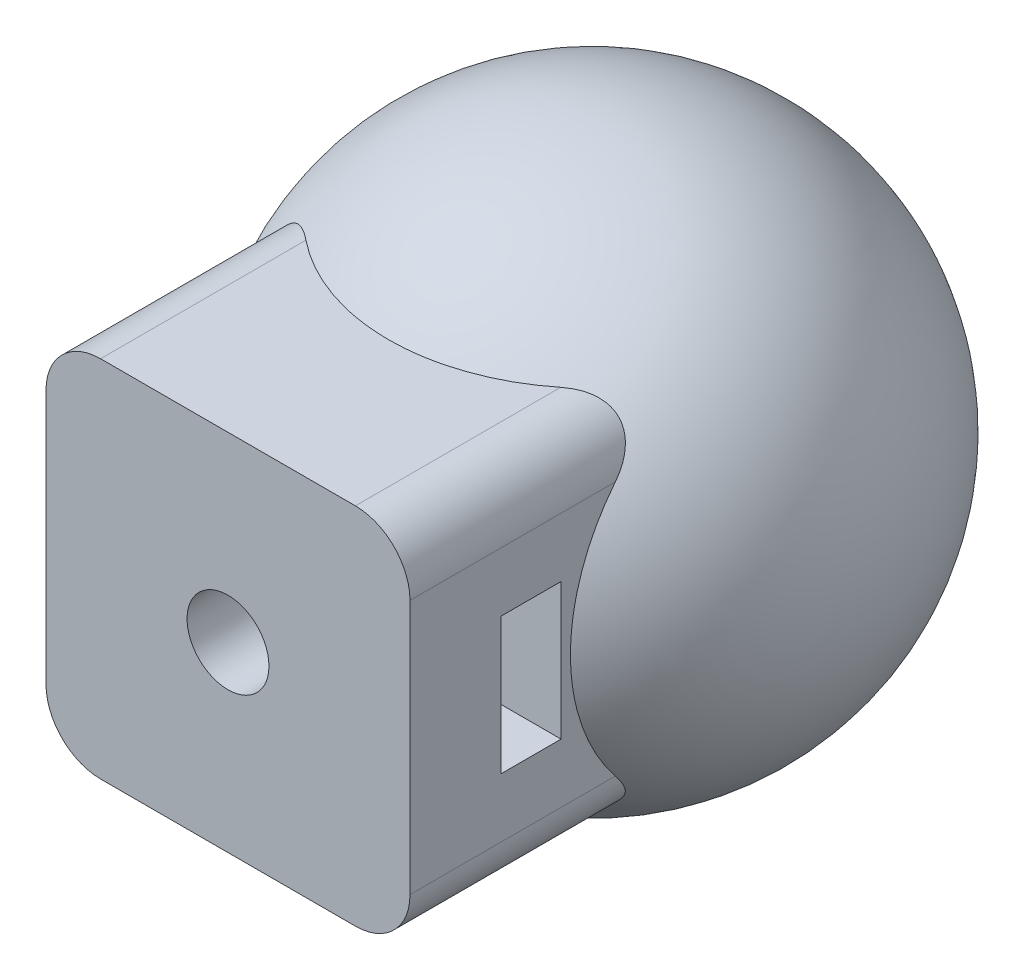
ISO-10303-21;
HEADER;
FILE_DESCRIPTION(('STEP AP214'),'2;1');
FILE_NAME('part.step','',(''),(''),'','','');
FILE_SCHEMA(('AUTOMOTIVE_DESIGN { 1 0 10303 214 1 1 1 1 }'));
ENDSEC;
DATA;
#1=APPLICATION_CONTEXT('core data for automotive mechanical design processes');
#2=APPLICATION_PROTOCOL_DEFINITION('international standard','automotive_design',2000,#1);
#3=PRODUCT_CONTEXT('',#1,'mechanical');
#4=PRODUCT('Part','Part','',(#3));
#5=PRODUCT_RELATED_PRODUCT_CATEGORY('part','',(#4));
#6=PRODUCT_DEFINITION_FORMATION('','',#4);
#7=PRODUCT_DEFINITION_CONTEXT('part definition',#1,'design');
#8=PRODUCT_DEFINITION('design','',#6,#7);
#9=PRODUCT_DEFINITION_SHAPE('','',#8);
#10=(LENGTH_UNIT() NAMED_UNIT(*) SI_UNIT(.MILLI.,.METRE.));
#11=(NAMED_UNIT(*) PLANE_ANGLE_UNIT() SI_UNIT($,.RADIAN.));
#12=(NAMED_UNIT(*) SI_UNIT($,.STERADIAN.) SOLID_ANGLE_UNIT());
#13=UNCERTAINTY_MEASURE_WITH_UNIT(LENGTH_MEASURE(1.E-05),#10,'distance_accuracy_value','');
#14=(GEOMETRIC_REPRESENTATION_CONTEXT(3) GLOBAL_UNCERTAINTY_ASSIGNED_CONTEXT((#13)) GLOBAL_UNIT_ASSIGNED_CONTEXT((#10,
#11,#12)) REPRESENTATION_CONTEXT('',''));
#15=CARTESIAN_POINT('',(0.,0.,0.));
#16=DIRECTION('',(0.,0.,1.));
#17=DIRECTION('',(1.,0.,0.));
#18=AXIS2_PLACEMENT_3D('',#15,#16,#17);
#19=CARTESIAN_POINT('',(9.99999999999999,10.,20.));
#20=DIRECTION('',(-1.,0.,0.));
#21=DIRECTION('',(0.,-1.,0.));
#22=AXIS2_PLACEMENT_3D('',#19,#20,#21);
#23=PLANE('',#22);
#24=DIRECTION('',(0.,1.,0.));
#25=VECTOR('',#24,1.);
#26=CARTESIAN_POINT('',(9.99999999999999,10.,20.));
#27=LINE('',#26,#25);
#28=CARTESIAN_POINT('',(10.,-7.,20.));
#29=VERTEX_POINT('',#28);
#30=CARTESIAN_POINT('',(9.99999999999999,7.,20.));
#31=VERTEX_POINT('',#30);
#32=EDGE_CURVE('E209',#29,#31,#27,.T.);
#33=ORIENTED_EDGE('',*,*,#32,.F.);
#34=DIRECTION('',(0.,0.,-1.));
#35=VECTOR('',#34,1.);
#36=CARTESIAN_POINT('',(10.,-7.,20.));
#37=LINE('',#36,#35);
#38=CARTESIAN_POINT('',(10.,-7.,8.71779788708134));
#39=VERTEX_POINT('',#38);
#40=EDGE_CURVE('E279',#29,#39,#37,.T.);
#41=ORIENTED_EDGE('',*,*,#40,.T.);
#42=CARTESIAN_POINT('',(10.,0.,0.));
#43=DIRECTION('',(-1.,0.,0.));
#44=DIRECTION('',(0.,-1.,0.));
#45=AXIS2_PLACEMENT_3D('',#42,#43,#44);
#46=CIRCLE('',#45,11.180339887499);
#47=CARTESIAN_POINT('',(9.99999999999999,7.,8.71779788708135));
#48=VERTEX_POINT('',#47);
#49=EDGE_CURVE('E240',#48,#39,#46,.F.);
#50=ORIENTED_EDGE('',*,*,#49,.F.);
#51=DIRECTION('',(0.,0.,-1.));
#52=VECTOR('',#51,1.);
#53=CARTESIAN_POINT('',(9.99999999999999,7.,20.));
#54=LINE('',#53,#52);
#55=EDGE_CURVE('E276',#48,#31,#54,.F.);
#56=ORIENTED_EDGE('',*,*,#55,.T.);
#57=EDGE_LOOP('',(#33,#41,#50,#56));
#58=FACE_BOUND('',#57,.T.);
#59=DIRECTION('',(0.,1.,0.));
#60=VECTOR('',#59,1.);
#61=CARTESIAN_POINT('',(10.,-3.75,11.7));
#62=LINE('',#61,#60);
#63=CARTESIAN_POINT('',(10.,-3.75,11.7));
#64=VERTEX_POINT('',#63);
#65=CARTESIAN_POINT('',(10.,3.75,11.7));
#66=VERTEX_POINT('',#65);
#67=EDGE_CURVE('E159',#64,#66,#62,.T.);
#68=ORIENTED_EDGE('',*,*,#67,.F.);
#69=DIRECTION('',(0.,0.,1.));
#70=VECTOR('',#69,1.);
#71=CARTESIAN_POINT('',(10.,-3.75,11.7));
#72=LINE('',#71,#70);
#73=CARTESIAN_POINT('',(10.,-3.75,15.));
#74=VERTEX_POINT('',#73);
#75=EDGE_CURVE('E139',#64,#74,#72,.T.);
#76=ORIENTED_EDGE('',*,*,#75,.T.);
#77=DIRECTION('',(0.,1.,0.));
#78=VECTOR('',#77,1.);
#79=CARTESIAN_POINT('',(10.,-3.75,15.));
#80=LINE('',#79,#78);
#81=CARTESIAN_POINT('',(10.,3.75,15.));
#82=VERTEX_POINT('',#81);
#83=EDGE_CURVE('E176',#74,#82,#80,.T.);
#84=ORIENTED_EDGE('',*,*,#83,.T.);
#85=DIRECTION('',(0.,0.,1.));
#86=VECTOR('',#85,1.);
#87=CARTESIAN_POINT('',(10.,3.75,11.7));
#88=LINE('',#87,#86);
#89=EDGE_CURVE('E151',#66,#82,#88,.T.);
#90=ORIENTED_EDGE('',*,*,#89,.F.);
#91=EDGE_LOOP('',(#68,#76,#84,#90));
#92=FACE_BOUND('',#91,.T.);
#93=ADVANCED_FACE('F39',(#58,#92),#23,.F.);
#94=CARTESIAN_POINT('',(-10.,10.,20.));
#95=DIRECTION('',(0.,-1.,0.));
#96=DIRECTION('',(0.,0.,-1.));
#97=AXIS2_PLACEMENT_3D('',#94,#95,#96);
#98=PLANE('',#97);
#99=DIRECTION('',(-1.,0.,0.));
#100=VECTOR('',#99,1.);
#101=CARTESIAN_POINT('',(-10.,10.,20.));
#102=LINE('',#101,#100);
#103=CARTESIAN_POINT('',(7.,10.,20.));
#104=VERTEX_POINT('',#103);
#105=CARTESIAN_POINT('',(-7.,10.,20.));
#106=VERTEX_POINT('',#105);
#107=EDGE_CURVE('E218',#104,#106,#102,.T.);
#108=ORIENTED_EDGE('',*,*,#107,.F.);
#109=DIRECTION('',(0.,0.,-1.));
#110=VECTOR('',#109,1.);
#111=CARTESIAN_POINT('',(7.,10.,20.));
#112=LINE('',#111,#110);
#113=CARTESIAN_POINT('',(7.,10.,8.71779788708135));
#114=VERTEX_POINT('',#113);
#115=EDGE_CURVE('E286',#104,#114,#112,.T.);
#116=ORIENTED_EDGE('',*,*,#115,.T.);
#117=CARTESIAN_POINT('',(0.,10.,0.));
#118=DIRECTION('',(0.,-1.,0.));
#119=DIRECTION('',(0.,0.,-1.));
#120=AXIS2_PLACEMENT_3D('',#117,#118,#119);
#121=CIRCLE('',#120,11.180339887499);
#122=CARTESIAN_POINT('',(-7.,10.,8.71779788708134));
#123=VERTEX_POINT('',#122);
#124=EDGE_CURVE('E237',#123,#114,#121,.F.);
#125=ORIENTED_EDGE('',*,*,#124,.F.);
#126=DIRECTION('',(0.,0.,-1.));
#127=VECTOR('',#126,1.);
#128=CARTESIAN_POINT('',(-7.,10.,20.));
#129=LINE('',#128,#127);
#130=EDGE_CURVE('E283',#123,#106,#129,.F.);
#131=ORIENTED_EDGE('',*,*,#130,.T.);
#132=EDGE_LOOP('',(#108,#116,#125,#131));
#133=FACE_BOUND('',#132,.T.);
#134=ADVANCED_FACE('F334',(#133),#98,.F.);
#135=CARTESIAN_POINT('',(-10.,10.,20.));
#136=DIRECTION('',(1.,0.,0.));
#137=DIRECTION('',(0.,1.,0.));
#138=AXIS2_PLACEMENT_3D('',#135,#136,#137);
#139=PLANE('',#138);
#140=CARTESIAN_POINT('',(-10.,0.,0.));
#141=DIRECTION('',(1.,0.,0.));
#142=DIRECTION('',(0.,1.,0.));
#143=AXIS2_PLACEMENT_3D('',#140,#141,#142);
#144=CIRCLE('',#143,11.1803398874989);
#145=CARTESIAN_POINT('',(-10.,-7.,8.71779788708134));
#146=VERTEX_POINT('',#145);
#147=CARTESIAN_POINT('',(-10.,7.,8.71779788708134));
#148=VERTEX_POINT('',#147);
#149=EDGE_CURVE('E234',#146,#148,#144,.F.);
#150=ORIENTED_EDGE('',*,*,#149,.F.);
#151=DIRECTION('',(0.,0.,-1.));
#152=VECTOR('',#151,1.);
#153=CARTESIAN_POINT('',(-10.,-7.,20.));
#154=LINE('',#153,#152);
#155=CARTESIAN_POINT('',(-10.,-7.,20.));
#156=VERTEX_POINT('',#155);
#157=EDGE_CURVE('E261',#146,#156,#154,.F.);
#158=ORIENTED_EDGE('',*,*,#157,.T.);
#159=DIRECTION('',(0.,-1.,0.));
#160=VECTOR('',#159,1.);
#161=CARTESIAN_POINT('',(-10.,10.,20.));
#162=LINE('',#161,#160);
#163=CARTESIAN_POINT('',(-10.,7.,20.));
#164=VERTEX_POINT('',#163);
#165=EDGE_CURVE('E222',#164,#156,#162,.T.);
#166=ORIENTED_EDGE('',*,*,#165,.F.);
#167=DIRECTION('',(0.,0.,-1.));
#168=VECTOR('',#167,1.);
#169=CARTESIAN_POINT('',(-10.,7.,20.));
#170=LINE('',#169,#168);
#171=EDGE_CURVE('E257',#164,#148,#170,.T.);
#172=ORIENTED_EDGE('',*,*,#171,.T.);
#173=EDGE_LOOP('',(#150,#158,#166,#172));
#174=FACE_BOUND('',#173,.T.);
#175=ADVANCED_FACE('F339',(#174),#139,.F.);
#176=CARTESIAN_POINT('',(-10.,-10.,20.));
#177=DIRECTION('',(0.,1.,0.));
#178=DIRECTION('',(0.,0.,1.));
#179=AXIS2_PLACEMENT_3D('',#176,#177,#178);
#180=PLANE('',#179);
#181=DIRECTION('',(1.,0.,0.));
#182=VECTOR('',#181,1.);
#183=CARTESIAN_POINT('',(-10.,-10.,20.));
#184=LINE('',#183,#182);
#185=CARTESIAN_POINT('',(-7.,-10.,20.));
#186=VERTEX_POINT('',#185);
#187=CARTESIAN_POINT('',(7.,-10.,20.));
#188=VERTEX_POINT('',#187);
#189=EDGE_CURVE('E226',#186,#188,#184,.T.);
#190=ORIENTED_EDGE('',*,*,#189,.F.);
#191=DIRECTION('',(0.,0.,-1.));
#192=VECTOR('',#191,1.);
#193=CARTESIAN_POINT('',(-7.,-10.,20.));
#194=LINE('',#193,#192);
#195=CARTESIAN_POINT('',(-7.,-10.,8.71779788708134));
#196=VERTEX_POINT('',#195);
#197=EDGE_CURVE('E253',#186,#196,#194,.T.);
#198=ORIENTED_EDGE('',*,*,#197,.T.);
#199=CARTESIAN_POINT('',(0.,-10.,0.));
#200=DIRECTION('',(0.,1.,0.));
#201=DIRECTION('',(0.,0.,1.));
#202=AXIS2_PLACEMENT_3D('',#199,#200,#201);
#203=CIRCLE('',#202,11.1803398874989);
#204=CARTESIAN_POINT('',(7.,-10.,8.71779788708134));
#205=VERTEX_POINT('',#204);
#206=EDGE_CURVE('E230',#205,#196,#203,.F.);
#207=ORIENTED_EDGE('',*,*,#206,.F.);
#208=DIRECTION('',(0.,0.,-1.));
#209=VECTOR('',#208,1.);
#210=CARTESIAN_POINT('',(7.,-10.,20.));
#211=LINE('',#210,#209);
#212=EDGE_CURVE('E244',#205,#188,#211,.F.);
#213=ORIENTED_EDGE('',*,*,#212,.T.);
#214=EDGE_LOOP('',(#190,#198,#207,#213));
#215=FACE_BOUND('',#214,.T.);
#216=ADVANCED_FACE('F351',(#215),#180,.F.);
#217=CARTESIAN_POINT('',(0.,0.,20.));
#218=DIRECTION('',(0.,0.,1.));
#219=DIRECTION('',(1.,0.,0.));
#220=AXIS2_PLACEMENT_3D('',#217,#218,#219);
#221=PLANE('',#220);
#222=CARTESIAN_POINT('',(0.,0.,20.));
#223=DIRECTION('',(0.,0.,1.));
#224=DIRECTION('',(1.,0.,0.));
#225=AXIS2_PLACEMENT_3D('',#222,#223,#224);
#226=CIRCLE('',#225,2.25);
#227=CARTESIAN_POINT('',(2.25,0.,20.));
#228=VERTEX_POINT('',#227);
#229=EDGE_CURVE('E210',#228,#228,#226,.T.);
#230=ORIENTED_EDGE('',*,*,#229,.F.);
#231=EDGE_LOOP('',(#230));
#232=FACE_BOUND('',#231,.T.);
#233=ORIENTED_EDGE('',*,*,#165,.T.);
#234=CARTESIAN_POINT('',(-7.,-7.,20.));
#235=DIRECTION('',(0.,0.,1.));
#236=DIRECTION('',(1.,0.,0.));
#237=AXIS2_PLACEMENT_3D('',#234,#235,#236);
#238=CIRCLE('',#237,3.);
#239=EDGE_CURVE('E273',#156,#186,#238,.T.);
#240=ORIENTED_EDGE('',*,*,#239,.T.);
#241=ORIENTED_EDGE('',*,*,#189,.T.);
#242=CARTESIAN_POINT('',(7.,-7.,20.));
#243=DIRECTION('',(0.,0.,1.));
#244=DIRECTION('',(1.,0.,0.));
#245=AXIS2_PLACEMENT_3D('',#242,#243,#244);
#246=CIRCLE('',#245,3.);
#247=EDGE_CURVE('E270',#188,#29,#246,.T.);
#248=ORIENTED_EDGE('',*,*,#247,.T.);
#249=ORIENTED_EDGE('',*,*,#32,.T.);
#250=CARTESIAN_POINT('',(7.,7.,20.));
#251=DIRECTION('',(0.,0.,1.));
#252=DIRECTION('',(1.,0.,0.));
#253=AXIS2_PLACEMENT_3D('',#250,#251,#252);
#254=CIRCLE('',#253,3.);
#255=EDGE_CURVE('E267',#31,#104,#254,.T.);
#256=ORIENTED_EDGE('',*,*,#255,.T.);
#257=ORIENTED_EDGE('',*,*,#107,.T.);
#258=CARTESIAN_POINT('',(-7.,7.,20.));
#259=DIRECTION('',(0.,0.,1.));
#260=DIRECTION('',(1.,0.,0.));
#261=AXIS2_PLACEMENT_3D('',#258,#259,#260);
#262=CIRCLE('',#261,3.);
#263=EDGE_CURVE('E264',#106,#164,#262,.T.);
#264=ORIENTED_EDGE('',*,*,#263,.T.);
#265=EDGE_LOOP('',(#233,#240,#241,#248,#249,#256,#257,#264));
#266=FACE_BOUND('',#265,.T.);
#267=ADVANCED_FACE('F310',(#232,#266),#221,.T.);
#268=CARTESIAN_POINT('',(0.,0.,0.));
#269=DIRECTION('',(0.,0.,-1.));
#270=DIRECTION('',(1.,0.,0.));
#271=AXIS2_PLACEMENT_3D('',#268,#269,#270);
#272=SPHERICAL_SURFACE('',#271,15.);
#273=ORIENTED_EDGE('',*,*,#149,.T.);
#274=CARTESIAN_POINT('',(-10.,7.,8.71779788708134));
#275=CARTESIAN_POINT('',(-9.9999865171771,7.07380728142186,8.65855242465088));
#276=CARTESIAN_POINT('',(-9.99727488913853,7.14840146220599,8.600222388677));
#277=CARTESIAN_POINT('',(-9.98600706176711,7.29918903197712,8.48589980026473));
#278=CARTESIAN_POINT('',(-9.97743750646705,7.37538568897804,8.42991290035328));
#279=CARTESIAN_POINT('',(-9.95383572409334,7.53015220602243,8.3202897625181));
#280=CARTESIAN_POINT('',(-9.93871373916942,7.60874039153881,8.26669801329384));
#281=CARTESIAN_POINT('',(-9.90146235223786,7.76688427636998,8.16368782377351));
#282=CARTESIAN_POINT('',(-9.87933964347021,7.84643898204133,8.11426545415474));
#283=CARTESIAN_POINT('',(-9.81832581961699,8.0343811844784,8.0041298030661));
#284=CARTESIAN_POINT('',(-9.77627304191545,8.14305437168936,7.94557120269984));
#285=CARTESIAN_POINT('',(-9.67698404600658,8.35934204300318,7.84181939273824));
#286=CARTESIAN_POINT('',(-9.61982088727192,8.46695910398894,7.79656402754864));
#287=CARTESIAN_POINT('',(-9.50038635921809,8.66096398446801,7.72929771396409));
#288=CARTESIAN_POINT('',(-9.44052819937238,8.74791633443947,7.70467865287626));
#289=CARTESIAN_POINT('',(-9.31029671120553,8.91673408257426,7.66954298017947));
#290=CARTESIAN_POINT('',(-9.2399256184235,8.99860055700403,7.65902337510045));
#291=CARTESIAN_POINT('',(-9.09024946106367,9.15466127053226,7.65318634836753));
#292=CARTESIAN_POINT('',(-9.01092658835395,9.22883963264905,7.65789976379813));
#293=CARTESIAN_POINT('',(-8.84607694651082,9.36719384818717,7.68207949141782));
#294=CARTESIAN_POINT('',(-8.76054704581329,9.43136460044228,7.70155329795828));
#295=CARTESIAN_POINT('',(-8.56895395928733,9.56011247730947,7.75848014115343));
#296=CARTESIAN_POINT('',(-8.46213893154844,9.62232899318502,7.79869853431758));
#297=CARTESIAN_POINT('',(-8.24694875690766,9.73125337711435,7.89350457239546));
#298=CARTESIAN_POINT('',(-8.13857066829676,9.77792644140171,7.94812397991267));
#299=CARTESIAN_POINT('',(-7.87481269652484,9.87440749451617,8.09433756307999));
#300=CARTESIAN_POINT('',(-7.71980259396024,9.91650524014545,8.19161053796416));
#301=CARTESIAN_POINT('',(-7.41452447662661,9.97529432386384,8.3996056391021));
#302=CARTESIAN_POINT('',(-7.26425676466793,9.99198404280492,8.51032862198358));
#303=CARTESIAN_POINT('',(-7.07778505764593,9.99924450415279,8.65578166489348));
#304=CARTESIAN_POINT('',(-7.03877953575704,9.99999433403824,8.68666742490803));
#305=CARTESIAN_POINT('',(-7.,10.,8.71779788708134));
#306=B_SPLINE_CURVE_WITH_KNOTS('',3,(#274,#275,#276,#277,#278,#279,#280,#281,#282,#283,#284,
#285,#286,#287,#288,#289,#290,#291,#292,#293,#294,#295,#296,#297,#298,#299,#300,#301,#302,#303,
#304,#305),.UNSPECIFIED.,.F.,.F.,(4,2,2,2,2,2,2,2,2,2,2,2,2,2,2,4),(0.,0.283946578206707,
0.568542718262642,0.857167122769165,1.14551640924863,1.53543151175275,1.92349478489269,
2.24729988231267,2.57103622144253,2.89542832895393,3.21998525176664,3.60782759075428,
3.99653260903436,4.55681713738935,5.11713736885649,5.26637404626644),.UNSPECIFIED.);
#307=EDGE_CURVE('E11',#148,#123,#306,.T.);
#308=ORIENTED_EDGE('',*,*,#307,.T.);
#309=ORIENTED_EDGE('',*,*,#124,.T.);
#310=CARTESIAN_POINT('',(7.,10.,8.71779788708135));
#311=CARTESIAN_POINT('',(7.07380728142186,9.9999865171771,8.65855242465089));
#312=CARTESIAN_POINT('',(7.14840146220599,9.99727488913852,8.600222388677));
#313=CARTESIAN_POINT('',(7.29918903197712,9.98600706176711,8.48589980026474));
#314=CARTESIAN_POINT('',(7.37538568897804,9.97743750646705,8.42991290035329));
#315=CARTESIAN_POINT('',(7.53015220602242,9.95383572409333,8.3202897625181));
#316=CARTESIAN_POINT('',(7.6087403915388,9.93871373916942,8.26669801329385));
#317=CARTESIAN_POINT('',(7.76688427636997,9.90146235223786,8.16368782377352));
#318=CARTESIAN_POINT('',(7.84643898204132,9.87933964347021,8.11426545415475));
#319=CARTESIAN_POINT('',(8.0343811844784,9.81832581961699,8.00412980306612));
#320=CARTESIAN_POINT('',(8.14305437168935,9.77627304191544,7.94557120269985));
#321=CARTESIAN_POINT('',(8.35934204300317,9.67698404600657,7.84181939273825));
#322=CARTESIAN_POINT('',(8.46695910398893,9.61982088727192,7.79656402754865));
#323=CARTESIAN_POINT('',(8.660963984468,9.50038635921809,7.7292977139641));
#324=CARTESIAN_POINT('',(8.74791633443947,9.44052819937238,7.70467865287627));
#325=CARTESIAN_POINT('',(8.91673408257425,9.31029671120552,7.66954298017948));
#326=CARTESIAN_POINT('',(8.99860055700403,9.2399256184235,7.65902337510045));
#327=CARTESIAN_POINT('',(9.15466127053226,9.09024946106367,7.65318634836754));
#328=CARTESIAN_POINT('',(9.22883963264905,9.01092658835394,7.65789976379814));
#329=CARTESIAN_POINT('',(9.36719384818717,8.84607694651081,7.68207949141784));
#330=CARTESIAN_POINT('',(9.43136460044227,8.76054704581328,7.70155329795829));
#331=CARTESIAN_POINT('',(9.56011247730947,8.56895395928733,7.75848014115345));
#332=CARTESIAN_POINT('',(9.62232899318501,8.46213893154844,7.79869853431759));
#333=CARTESIAN_POINT('',(9.73125337711435,8.24694875690765,7.89350457239547));
#334=CARTESIAN_POINT('',(9.7779264414017,8.13857066829675,7.94812397991268));
#335=CARTESIAN_POINT('',(9.87440749451617,7.87481269652483,8.09433756308));
#336=CARTESIAN_POINT('',(9.91650524014544,7.71980259396024,8.19161053796417));
#337=CARTESIAN_POINT('',(9.97529432386384,7.41452447662661,8.39960563910211));
#338=CARTESIAN_POINT('',(9.99198404280492,7.26425676466793,8.51032862198359));
#339=CARTESIAN_POINT('',(9.99924450415278,7.07778505764593,8.65578166489349));
#340=CARTESIAN_POINT('',(9.99999433403824,7.03877953575704,8.68666742490804));
#341=CARTESIAN_POINT('',(10.,7.,8.71779788708135));
#342=B_SPLINE_CURVE_WITH_KNOTS('',3,(#310,#311,#312,#313,#314,#315,#316,#317,#318,#319,#320,
#321,#322,#323,#324,#325,#326,#327,#328,#329,#330,#331,#332,#333,#334,#335,#336,#337,#338,#339,
#340,#341),.UNSPECIFIED.,.F.,.F.,(4,2,2,2,2,2,2,2,2,2,2,2,2,2,2,4),(0.,0.283946578206708,
0.568542718262641,0.857167122769162,1.14551640924862,1.53543151175274,1.92349478489269,
2.24729988231266,2.57103622144253,2.89542832895393,3.21998525176664,3.60782759075428,
3.99653260903436,4.55681713738934,5.11713736885649,5.26637404626643),.UNSPECIFIED.);
#343=EDGE_CURVE('E54',#114,#48,#342,.T.);
#344=ORIENTED_EDGE('',*,*,#343,.T.);
#345=ORIENTED_EDGE('',*,*,#49,.T.);
#346=CARTESIAN_POINT('',(10.,-7.,8.71779788708134));
#347=CARTESIAN_POINT('',(9.9999865171771,-7.07380728142187,8.65855242465088));
#348=CARTESIAN_POINT('',(9.99727488913852,-7.14840146220599,8.600222388677));
#349=CARTESIAN_POINT('',(9.98600706176711,-7.29918903197713,8.48589980026473));
#350=CARTESIAN_POINT('',(9.97743750646705,-7.37538568897805,8.42991290035329));
#351=CARTESIAN_POINT('',(9.95383572409333,-7.53015220602243,8.3202897625181));
#352=CARTESIAN_POINT('',(9.93871373916942,-7.60874039153882,8.26669801329385));
#353=CARTESIAN_POINT('',(9.90146235223786,-7.76688427636998,8.16368782377351));
#354=CARTESIAN_POINT('',(9.87933964347021,-7.84643898204133,8.11426545415474));
#355=CARTESIAN_POINT('',(9.81832581961699,-8.03438118447841,8.00412980306611));
#356=CARTESIAN_POINT('',(9.77627304191544,-8.14305437168936,7.94557120269984));
#357=CARTESIAN_POINT('',(9.67698404600657,-8.35934204300319,7.84181939273824));
#358=CARTESIAN_POINT('',(9.61982088727192,-8.46695910398894,7.79656402754864));
#359=CARTESIAN_POINT('',(9.50038635921808,-8.66096398446801,7.72929771396409));
#360=CARTESIAN_POINT('',(9.44052819937237,-8.74791633443948,7.70467865287627));
#361=CARTESIAN_POINT('',(9.31029671120552,-8.91673408257426,7.66954298017947));
#362=CARTESIAN_POINT('',(9.2399256184235,-8.99860055700404,7.65902337510045));
#363=CARTESIAN_POINT('',(9.09024946106367,-9.15466127053226,7.65318634836753));
#364=CARTESIAN_POINT('',(9.01092658835394,-9.22883963264906,7.65789976379813));
#365=CARTESIAN_POINT('',(8.84607694651081,-9.36719384818718,7.68207949141783));
#366=CARTESIAN_POINT('',(8.76054704581329,-9.43136460044228,7.70155329795828));
#367=CARTESIAN_POINT('',(8.56895395928733,-9.56011247730947,7.75848014115344));
#368=CARTESIAN_POINT('',(8.46213893154844,-9.62232899318502,7.79869853431758));
#369=CARTESIAN_POINT('',(8.24694875690765,-9.73125337711436,7.89350457239546));
#370=CARTESIAN_POINT('',(8.13857066829676,-9.77792644140171,7.94812397991267));
#371=CARTESIAN_POINT('',(7.87481269652484,-9.87440749451617,8.09433756307999));
#372=CARTESIAN_POINT('',(7.71980259396024,-9.91650524014545,8.19161053796416));
#373=CARTESIAN_POINT('',(7.41452447662661,-9.97529432386385,8.3996056391021));
#374=CARTESIAN_POINT('',(7.26425676466793,-9.99198404280493,8.51032862198358));
#375=CARTESIAN_POINT('',(7.07778505764593,-9.99924450415279,8.65578166489347));
#376=CARTESIAN_POINT('',(7.03877953575704,-9.99999433403824,8.68666742490803));
#377=CARTESIAN_POINT('',(7.,-10.,8.71779788708134));
#378=B_SPLINE_CURVE_WITH_KNOTS('',3,(#346,#347,#348,#349,#350,#351,#352,#353,#354,#355,#356,
#357,#358,#359,#360,#361,#362,#363,#364,#365,#366,#367,#368,#369,#370,#371,#372,#373,#374,#375,
#376,#377),.UNSPECIFIED.,.F.,.F.,(4,2,2,2,2,2,2,2,2,2,2,2,2,2,2,4),(0.,0.283946578206707,
0.568542718262643,0.857167122769166,1.14551640924863,1.53543151175274,1.92349478489269,
2.24729988231267,2.57103622144253,2.89542832895393,3.21998525176664,3.60782759075428,
3.99653260903436,4.55681713738934,5.11713736885648,5.26637404626644),.UNSPECIFIED.);
#379=EDGE_CURVE('E297',#39,#205,#378,.T.);
#380=ORIENTED_EDGE('',*,*,#379,.T.);
#381=ORIENTED_EDGE('',*,*,#206,.T.);
#382=CARTESIAN_POINT('',(-7.,-10.,8.71779788708134));
#383=CARTESIAN_POINT('',(-7.07380728142187,-9.9999865171771,8.65855242465087));
#384=CARTESIAN_POINT('',(-7.14840146220599,-9.99727488913853,8.60022238867699));
#385=CARTESIAN_POINT('',(-7.29918903197713,-9.98600706176711,8.48589980026473));
#386=CARTESIAN_POINT('',(-7.37538568897805,-9.97743750646705,8.42991290035328));
#387=CARTESIAN_POINT('',(-7.53015220602243,-9.95383572409334,8.3202897625181));
#388=CARTESIAN_POINT('',(-7.60874039153881,-9.93871373916942,8.26669801329384));
#389=CARTESIAN_POINT('',(-7.76688427636998,-9.90146235223786,8.16368782377351));
#390=CARTESIAN_POINT('',(-7.84643898204133,-9.87933964347021,8.11426545415474));
#391=CARTESIAN_POINT('',(-8.03438118447841,-9.81832581961699,8.0041298030661));
#392=CARTESIAN_POINT('',(-8.14305437168936,-9.77627304191545,7.94557120269984));
#393=CARTESIAN_POINT('',(-8.35934204300318,-9.67698404600658,7.84181939273824));
#394=CARTESIAN_POINT('',(-8.46695910398894,-9.61982088727192,7.79656402754864));
#395=CARTESIAN_POINT('',(-8.66096398446801,-9.50038635921809,7.72929771396409));
#396=CARTESIAN_POINT('',(-8.74791633443948,-9.44052819937238,7.70467865287626));
#397=CARTESIAN_POINT('',(-8.91673408257426,-9.31029671120553,7.66954298017947));
#398=CARTESIAN_POINT('',(-8.99860055700404,-9.2399256184235,7.65902337510044));
#399=CARTESIAN_POINT('',(-9.15466127053226,-9.09024946106367,7.65318634836753));
#400=CARTESIAN_POINT('',(-9.22883963264906,-9.01092658835394,7.65789976379813));
#401=CARTESIAN_POINT('',(-9.36719384818718,-8.84607694651081,7.68207949141782));
#402=CARTESIAN_POINT('',(-9.43136460044228,-8.76054704581329,7.70155329795828));
#403=CARTESIAN_POINT('',(-9.56011247730947,-8.56895395928733,7.75848014115343));
#404=CARTESIAN_POINT('',(-9.62232899318502,-8.46213893154844,7.79869853431758));
#405=CARTESIAN_POINT('',(-9.73125337711436,-8.24694875690765,7.89350457239546));
#406=CARTESIAN_POINT('',(-9.77792644140171,-8.13857066829676,7.94812397991267));
#407=CARTESIAN_POINT('',(-9.87440749451617,-7.87481269652484,8.09433756307999));
#408=CARTESIAN_POINT('',(-9.91650524014545,-7.71980259396024,8.19161053796416));
#409=CARTESIAN_POINT('',(-9.97529432386385,-7.41452447662661,8.3996056391021));
#410=CARTESIAN_POINT('',(-9.99198404280493,-7.26425676466793,8.51032862198358));
#411=CARTESIAN_POINT('',(-9.99924450415279,-7.07778505764593,8.65578166489348));
#412=CARTESIAN_POINT('',(-9.99999433403824,-7.03877953575704,8.68666742490803));
#413=CARTESIAN_POINT('',(-10.,-7.,8.71779788708134));
#414=B_SPLINE_CURVE_WITH_KNOTS('',3,(#382,#383,#384,#385,#386,#387,#388,#389,#390,#391,#392,
#393,#394,#395,#396,#397,#398,#399,#400,#401,#402,#403,#404,#405,#406,#407,#408,#409,#410,#411,
#412,#413),.UNSPECIFIED.,.F.,.F.,(4,2,2,2,2,2,2,2,2,2,2,2,2,2,2,4),(0.,0.283946578206707,
0.568542718262642,0.857167122769165,1.14551640924863,1.53543151175274,1.92349478489269,
2.24729988231267,2.57103622144253,2.89542832895393,3.21998525176664,3.60782759075428,
3.99653260903437,4.55681713738935,5.1171373688565,5.26637404626644),.UNSPECIFIED.);
#415=EDGE_CURVE('E289',#196,#146,#414,.T.);
#416=ORIENTED_EDGE('',*,*,#415,.T.);
#417=EDGE_LOOP('',(#273,#308,#309,#344,#345,#380,#381,#416));
#418=FACE_BOUND('',#417,.T.);
#419=ADVANCED_FACE('F305',(#418),#272,.T.);
#420=CARTESIAN_POINT('',(0.,0.,0.));
#421=DIRECTION('',(0.,0.,1.));
#422=DIRECTION('',(1.,0.,0.));
#423=AXIS2_PLACEMENT_3D('',#420,#421,#422);
#424=CYLINDRICAL_SURFACE('',#423,2.25);
#425=CARTESIAN_POINT('',(0.,0.,15.));
#426=DIRECTION('',(0.,0.,1.));
#427=DIRECTION('',(1.,0.,0.));
#428=AXIS2_PLACEMENT_3D('',#425,#426,#427);
#429=CIRCLE('',#428,2.25);
#430=CARTESIAN_POINT('',(2.25,0.,15.));
#431=VERTEX_POINT('',#430);
#432=EDGE_CURVE('E196',#431,#431,#429,.F.);
#433=ORIENTED_EDGE('',*,*,#432,.T.);
#434=EDGE_LOOP('',(#433));
#435=FACE_BOUND('',#434,.T.);
#436=ORIENTED_EDGE('',*,*,#229,.T.);
#437=EDGE_LOOP('',(#436));
#438=FACE_BOUND('',#437,.T.);
#439=ADVANCED_FACE('F309',(#435,#438),#424,.F.);
#440=CARTESIAN_POINT('',(0.,0.,11.7));
#441=DIRECTION('',(0.,0.,1.));
#442=DIRECTION('',(1.,0.,0.));
#443=AXIS2_PLACEMENT_3D('',#440,#441,#442);
#444=PLANE('',#443);
#445=DIRECTION('',(1.,0.,0.));
#446=VECTOR('',#445,1.);
#447=CARTESIAN_POINT('',(2.1650635094611,-3.75,11.7));
#448=LINE('',#447,#446);
#449=CARTESIAN_POINT('',(-2.1650635094611,-3.75,11.7));
#450=VERTEX_POINT('',#449);
#451=EDGE_CURVE('E142',#450,#64,#448,.T.);
#452=ORIENTED_EDGE('',*,*,#451,.T.);
#453=ORIENTED_EDGE('',*,*,#67,.T.);
#454=DIRECTION('',(1.,0.,0.));
#455=VECTOR('',#454,1.);
#456=CARTESIAN_POINT('',(2.1650635094611,3.75,11.7));
#457=LINE('',#456,#455);
#458=CARTESIAN_POINT('',(-2.1650635094611,3.75,11.7));
#459=VERTEX_POINT('',#458);
#460=EDGE_CURVE('E166',#459,#66,#457,.T.);
#461=ORIENTED_EDGE('',*,*,#460,.F.);
#462=DIRECTION('',(-0.5,-0.866025403784439,0.));
#463=VECTOR('',#462,1.);
#464=CARTESIAN_POINT('',(-2.1650635094611,3.75,11.7));
#465=LINE('',#464,#463);
#466=CARTESIAN_POINT('',(-4.33012701892219,0.,11.7));
#467=VERTEX_POINT('',#466);
#468=EDGE_CURVE('E169',#459,#467,#465,.T.);
#469=ORIENTED_EDGE('',*,*,#468,.T.);
#470=DIRECTION('',(0.5,-0.866025403784439,0.));
#471=VECTOR('',#470,1.);
#472=CARTESIAN_POINT('',(-4.33012701892219,0.,11.7));
#473=LINE('',#472,#471);
#474=EDGE_CURVE('E152',#467,#450,#473,.T.);
#475=ORIENTED_EDGE('',*,*,#474,.T.);
#476=EDGE_LOOP('',(#452,#453,#461,#469,#475));
#477=FACE_BOUND('',#476,.T.);
#478=CARTESIAN_POINT('',(0.,0.,11.7));
#479=DIRECTION('',(0.,0.,1.));
#480=DIRECTION('',(1.,0.,0.));
#481=AXIS2_PLACEMENT_3D('',#478,#479,#480);
#482=CIRCLE('',#481,2.25);
#483=CARTESIAN_POINT('',(2.25,0.,11.7));
#484=VERTEX_POINT('',#483);
#485=EDGE_CURVE('E214',#484,#484,#482,.F.);
#486=ORIENTED_EDGE('',*,*,#485,.T.);
#487=EDGE_LOOP('',(#486));
#488=FACE_BOUND('',#487,.T.);
#489=ADVANCED_FACE('F157',(#477,#488),#444,.T.);
#490=CARTESIAN_POINT('',(0.,0.,15.));
#491=DIRECTION('',(0.,0.,1.));
#492=DIRECTION('',(1.,0.,0.));
#493=AXIS2_PLACEMENT_3D('',#490,#491,#492);
#494=PLANE('',#493);
#495=DIRECTION('',(1.,0.,0.));
#496=VECTOR('',#495,1.);
#497=CARTESIAN_POINT('',(-2.1650635094611,-3.75,15.));
#498=LINE('',#497,#496);
#499=CARTESIAN_POINT('',(-2.1650635094611,-3.75,15.));
#500=VERTEX_POINT('',#499);
#501=EDGE_CURVE('E145',#500,#74,#498,.T.);
#502=ORIENTED_EDGE('',*,*,#501,.F.);
#503=DIRECTION('',(0.5,-0.866025403784439,0.));
#504=VECTOR('',#503,1.);
#505=CARTESIAN_POINT('',(-4.33012701892219,0.,15.));
#506=LINE('',#505,#504);
#507=CARTESIAN_POINT('',(-4.33012701892219,0.,15.));
#508=VERTEX_POINT('',#507);
#509=EDGE_CURVE('E187',#508,#500,#506,.T.);
#510=ORIENTED_EDGE('',*,*,#509,.F.);
#511=DIRECTION('',(-0.5,-0.866025403784439,0.));
#512=VECTOR('',#511,1.);
#513=CARTESIAN_POINT('',(-2.1650635094611,3.75,15.));
#514=LINE('',#513,#512);
#515=CARTESIAN_POINT('',(-2.1650635094611,3.75,15.));
#516=VERTEX_POINT('',#515);
#517=EDGE_CURVE('E183',#516,#508,#514,.T.);
#518=ORIENTED_EDGE('',*,*,#517,.F.);
#519=DIRECTION('',(-1.,0.,0.));
#520=VECTOR('',#519,1.);
#521=CARTESIAN_POINT('',(2.1650635094611,3.75,15.));
#522=LINE('',#521,#520);
#523=EDGE_CURVE('E179',#82,#516,#522,.T.);
#524=ORIENTED_EDGE('',*,*,#523,.F.);
#525=ORIENTED_EDGE('',*,*,#83,.F.);
#526=EDGE_LOOP('',(#502,#510,#518,#524,#525));
#527=FACE_BOUND('',#526,.T.);
#528=ORIENTED_EDGE('',*,*,#432,.F.);
#529=EDGE_LOOP('',(#528));
#530=FACE_BOUND('',#529,.T.);
#531=ADVANCED_FACE('F465',(#527,#530),#494,.F.);
#532=CARTESIAN_POINT('',(-2.1650635094611,-3.75,11.7));
#533=DIRECTION('',(0.,-1.,0.));
#534=DIRECTION('',(1.,0.,0.));
#535=AXIS2_PLACEMENT_3D('',#532,#533,#534);
#536=PLANE('',#535);
#537=ORIENTED_EDGE('',*,*,#501,.T.);
#538=ORIENTED_EDGE('',*,*,#75,.F.);
#539=ORIENTED_EDGE('',*,*,#451,.F.);
#540=DIRECTION('',(0.,0.,1.));
#541=VECTOR('',#540,1.);
#542=CARTESIAN_POINT('',(-2.1650635094611,-3.75,11.7));
#543=LINE('',#542,#541);
#544=EDGE_CURVE('E193',#450,#500,#543,.T.);
#545=ORIENTED_EDGE('',*,*,#544,.T.);
#546=EDGE_LOOP('',(#537,#538,#539,#545));
#547=FACE_BOUND('',#546,.T.);
#548=ADVANCED_FACE('F141',(#547),#536,.F.);
#549=CARTESIAN_POINT('',(-4.33012701892219,0.,11.7));
#550=DIRECTION('',(-0.866025403784439,-0.5,0.));
#551=DIRECTION('',(0.5,-0.866025403784439,0.));
#552=AXIS2_PLACEMENT_3D('',#549,#550,#551);
#553=PLANE('',#552);
#554=ORIENTED_EDGE('',*,*,#509,.T.);
#555=ORIENTED_EDGE('',*,*,#544,.F.);
#556=ORIENTED_EDGE('',*,*,#474,.F.);
#557=DIRECTION('',(0.,0.,1.));
#558=VECTOR('',#557,1.);
#559=CARTESIAN_POINT('',(-4.33012701892219,0.,11.7));
#560=LINE('',#559,#558);
#561=EDGE_CURVE('E197',#467,#508,#560,.T.);
#562=ORIENTED_EDGE('',*,*,#561,.T.);
#563=EDGE_LOOP('',(#554,#555,#556,#562));
#564=FACE_BOUND('',#563,.T.);
#565=ADVANCED_FACE('F450',(#564),#553,.F.);
#566=CARTESIAN_POINT('',(-2.1650635094611,3.75,11.7));
#567=DIRECTION('',(-0.866025403784439,0.5,0.));
#568=DIRECTION('',(-0.5,-0.866025403784439,0.));
#569=AXIS2_PLACEMENT_3D('',#566,#567,#568);
#570=PLANE('',#569);
#571=ORIENTED_EDGE('',*,*,#517,.T.);
#572=ORIENTED_EDGE('',*,*,#561,.F.);
#573=ORIENTED_EDGE('',*,*,#468,.F.);
#574=DIRECTION('',(0.,0.,1.));
#575=VECTOR('',#574,1.);
#576=CARTESIAN_POINT('',(-2.1650635094611,3.75,11.7));
#577=LINE('',#576,#575);
#578=EDGE_CURVE('E200',#459,#516,#577,.T.);
#579=ORIENTED_EDGE('',*,*,#578,.T.);
#580=EDGE_LOOP('',(#571,#572,#573,#579));
#581=FACE_BOUND('',#580,.T.);
#582=ADVANCED_FACE('F443',(#581),#570,.F.);
#583=CARTESIAN_POINT('',(2.1650635094611,3.75,11.7));
#584=DIRECTION('',(0.,1.,0.));
#585=DIRECTION('',(-1.,0.,0.));
#586=AXIS2_PLACEMENT_3D('',#583,#584,#585);
#587=PLANE('',#586);
#588=ORIENTED_EDGE('',*,*,#523,.T.);
#589=ORIENTED_EDGE('',*,*,#578,.F.);
#590=ORIENTED_EDGE('',*,*,#460,.T.);
#591=ORIENTED_EDGE('',*,*,#89,.T.);
#592=EDGE_LOOP('',(#588,#589,#590,#591));
#593=FACE_BOUND('',#592,.T.);
#594=ADVANCED_FACE('F436',(#593),#587,.F.);
#595=CARTESIAN_POINT('',(0.,0.,0.));
#596=DIRECTION('',(0.,0.,1.));
#597=DIRECTION('',(1.,0.,0.));
#598=AXIS2_PLACEMENT_3D('',#595,#596,#597);
#599=PLANE('',#598);
#600=CARTESIAN_POINT('',(0.,0.,0.));
#601=DIRECTION('',(0.,0.,1.));
#602=DIRECTION('',(1.,0.,0.));
#603=AXIS2_PLACEMENT_3D('',#600,#601,#602);
#604=CIRCLE('',#603,2.25);
#605=CARTESIAN_POINT('',(2.25,0.,0.));
#606=VERTEX_POINT('',#605);
#607=EDGE_CURVE('E205',#606,#606,#604,.T.);
#608=ORIENTED_EDGE('',*,*,#607,.T.);
#609=EDGE_LOOP('',(#608));
#610=FACE_BOUND('',#609,.T.);
#611=ADVANCED_FACE('F428',(#610),#599,.T.);
#612=ORIENTED_EDGE('',*,*,#607,.F.);
#613=EDGE_LOOP('',(#612));
#614=FACE_BOUND('',#613,.T.);
#615=ORIENTED_EDGE('',*,*,#485,.F.);
#616=EDGE_LOOP('',(#615));
#617=FACE_BOUND('',#616,.T.);
#618=ADVANCED_FACE('F330',(#614,#617),#424,.F.);
#619=CARTESIAN_POINT('',(-7.,-7.,20.));
#620=DIRECTION('',(0.,0.,-1.));
#621=DIRECTION('',(-1.,0.,0.));
#622=AXIS2_PLACEMENT_3D('',#619,#620,#621);
#623=CYLINDRICAL_SURFACE('',#622,3.);
#624=ORIENTED_EDGE('',*,*,#239,.F.);
#625=ORIENTED_EDGE('',*,*,#157,.F.);
#626=ORIENTED_EDGE('',*,*,#415,.F.);
#627=ORIENTED_EDGE('',*,*,#197,.F.);
#628=EDGE_LOOP('',(#624,#625,#626,#627));
#629=FACE_BOUND('',#628,.T.);
#630=ADVANCED_FACE('F303',(#629),#623,.T.);
#631=CARTESIAN_POINT('',(7.,-7.,20.));
#632=DIRECTION('',(0.,0.,-1.));
#633=DIRECTION('',(-1.,0.,0.));
#634=AXIS2_PLACEMENT_3D('',#631,#632,#633);
#635=CYLINDRICAL_SURFACE('',#634,3.);
#636=ORIENTED_EDGE('',*,*,#247,.F.);
#637=ORIENTED_EDGE('',*,*,#212,.F.);
#638=ORIENTED_EDGE('',*,*,#379,.F.);
#639=ORIENTED_EDGE('',*,*,#40,.F.);
#640=EDGE_LOOP('',(#636,#637,#638,#639));
#641=FACE_BOUND('',#640,.T.);
#642=ADVANCED_FACE('F323',(#641),#635,.T.);
#643=CARTESIAN_POINT('',(7.,7.,20.));
#644=DIRECTION('',(0.,0.,-1.));
#645=DIRECTION('',(-1.,0.,0.));
#646=AXIS2_PLACEMENT_3D('',#643,#644,#645);
#647=CYLINDRICAL_SURFACE('',#646,3.);
#648=ORIENTED_EDGE('',*,*,#255,.F.);
#649=ORIENTED_EDGE('',*,*,#55,.F.);
#650=ORIENTED_EDGE('',*,*,#343,.F.);
#651=ORIENTED_EDGE('',*,*,#115,.F.);
#652=EDGE_LOOP('',(#648,#649,#650,#651));
#653=FACE_BOUND('',#652,.T.);
#654=ADVANCED_FACE('F320',(#653),#647,.T.);
#655=CARTESIAN_POINT('',(-7.,7.,20.));
#656=DIRECTION('',(0.,0.,-1.));
#657=DIRECTION('',(-1.,0.,0.));
#658=AXIS2_PLACEMENT_3D('',#655,#656,#657);
#659=CYLINDRICAL_SURFACE('',#658,3.);
#660=ORIENTED_EDGE('',*,*,#263,.F.);
#661=ORIENTED_EDGE('',*,*,#130,.F.);
#662=ORIENTED_EDGE('',*,*,#307,.F.);
#663=ORIENTED_EDGE('',*,*,#171,.F.);
#664=EDGE_LOOP('',(#660,#661,#662,#663));
#665=FACE_BOUND('',#664,.T.);
#666=ADVANCED_FACE('F41',(#665),#659,.T.);
#667=CLOSED_SHELL('',(#93,#134,#175,#216,#267,#419,#439,#489,#531,#548,#565,#582,#594,#611,#618,
#630,#642,#654,#666));
#668=MANIFOLD_SOLID_BREP('B2',#667);
#669=ADVANCED_BREP_SHAPE_REPRESENTATION('',(#18,#668),#14);
#670=SHAPE_DEFINITION_REPRESENTATION(#9,#669);
ENDSEC;
END-ISO-10303-21;
